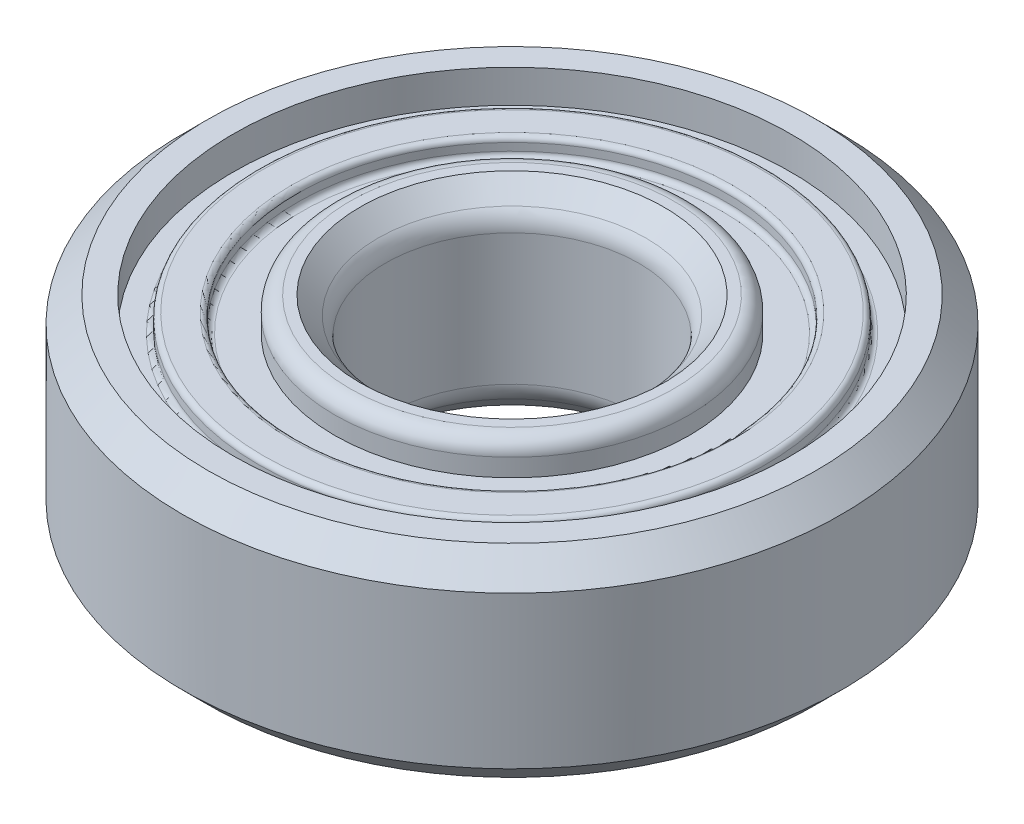
ISO-10303-21;
HEADER;
FILE_DESCRIPTION(('STEP AP214'),'2;1');
FILE_NAME('part.step','',(''),(''),'','','');
FILE_SCHEMA(('AUTOMOTIVE_DESIGN { 1 0 10303 214 1 1 1 1 }'));
ENDSEC;
DATA;
#1=APPLICATION_CONTEXT('core data for automotive mechanical design processes');
#2=APPLICATION_PROTOCOL_DEFINITION('international standard','automotive_design',2000,#1);
#3=PRODUCT_CONTEXT('',#1,'mechanical');
#4=PRODUCT('Part','Part','',(#3));
#5=PRODUCT_RELATED_PRODUCT_CATEGORY('part','',(#4));
#6=PRODUCT_DEFINITION_FORMATION('','',#4);
#7=PRODUCT_DEFINITION_CONTEXT('part definition',#1,'design');
#8=PRODUCT_DEFINITION('design','',#6,#7);
#9=PRODUCT_DEFINITION_SHAPE('','',#8);
#10=(LENGTH_UNIT() NAMED_UNIT(*) SI_UNIT(.MILLI.,.METRE.));
#11=(NAMED_UNIT(*) PLANE_ANGLE_UNIT() SI_UNIT($,.RADIAN.));
#12=(NAMED_UNIT(*) SI_UNIT($,.STERADIAN.) SOLID_ANGLE_UNIT());
#13=UNCERTAINTY_MEASURE_WITH_UNIT(LENGTH_MEASURE(1.E-05),#10,'distance_accuracy_value','');
#14=(GEOMETRIC_REPRESENTATION_CONTEXT(3) GLOBAL_UNCERTAINTY_ASSIGNED_CONTEXT((#13)) GLOBAL_UNIT_ASSIGNED_CONTEXT((#10,
#11,#12)) REPRESENTATION_CONTEXT('',''));
#15=CARTESIAN_POINT('',(0.,0.,0.));
#16=DIRECTION('',(0.,0.,1.));
#17=DIRECTION('',(1.,0.,0.));
#18=AXIS2_PLACEMENT_3D('',#15,#16,#17);
#19=CARTESIAN_POINT('',(0.,4.,0.));
#20=DIRECTION('',(0.,-1.,0.));
#21=DIRECTION('',(0.,0.,-1.));
#22=AXIS2_PLACEMENT_3D('',#19,#20,#21);
#23=CYLINDRICAL_SURFACE('',#22,13.);
#24=CARTESIAN_POINT('',(0.,-2.99999999999998,0.));
#25=DIRECTION('',(0.,-1.,0.));
#26=DIRECTION('',(0.,0.,-1.));
#27=AXIS2_PLACEMENT_3D('',#24,#25,#26);
#28=CIRCLE('',#27,13.);
#29=CARTESIAN_POINT('',(0.,-2.99999999999998,-13.));
#30=VERTEX_POINT('',#29);
#31=EDGE_CURVE('E103',#30,#30,#28,.F.);
#32=ORIENTED_EDGE('',*,*,#31,.T.);
#33=EDGE_LOOP('',(#32));
#34=FACE_BOUND('',#33,.T.);
#35=CARTESIAN_POINT('',(0.,3.,0.));
#36=DIRECTION('',(0.,1.,0.));
#37=DIRECTION('',(0.,0.,1.));
#38=AXIS2_PLACEMENT_3D('',#35,#36,#37);
#39=CIRCLE('',#38,13.);
#40=CARTESIAN_POINT('',(0.,3.,13.));
#41=VERTEX_POINT('',#40);
#42=EDGE_CURVE('E163',#41,#41,#39,.F.);
#43=ORIENTED_EDGE('',*,*,#42,.T.);
#44=EDGE_LOOP('',(#43));
#45=FACE_BOUND('',#44,.T.);
#46=ADVANCED_FACE('F39',(#34,#45),#23,.T.);
#47=CARTESIAN_POINT('',(0.,4.,0.));
#48=DIRECTION('',(0.,1.,0.));
#49=DIRECTION('',(0.,0.,1.));
#50=AXIS2_PLACEMENT_3D('',#47,#48,#49);
#51=PLANE('',#50);
#52=CARTESIAN_POINT('',(0.,4.,0.));
#53=DIRECTION('',(0.,1.,0.));
#54=DIRECTION('',(0.,0.,1.));
#55=AXIS2_PLACEMENT_3D('',#52,#53,#54);
#56=CIRCLE('',#55,12.);
#57=CARTESIAN_POINT('',(0.,4.,12.));
#58=VERTEX_POINT('',#57);
#59=EDGE_CURVE('E167',#58,#58,#56,.T.);
#60=ORIENTED_EDGE('',*,*,#59,.T.);
#61=EDGE_LOOP('',(#60));
#62=FACE_BOUND('',#61,.T.);
#63=CARTESIAN_POINT('',(0.,4.,0.));
#64=DIRECTION('',(0.,1.,0.));
#65=DIRECTION('',(0.,0.,1.));
#66=AXIS2_PLACEMENT_3D('',#63,#64,#65);
#67=CIRCLE('',#66,11.);
#68=CARTESIAN_POINT('',(0.,4.,11.));
#69=VERTEX_POINT('',#68);
#70=EDGE_CURVE('E172',#69,#69,#67,.T.);
#71=ORIENTED_EDGE('',*,*,#70,.F.);
#72=EDGE_LOOP('',(#71));
#73=FACE_BOUND('',#72,.T.);
#74=ADVANCED_FACE('F214',(#62,#73),#51,.T.);
#75=CARTESIAN_POINT('',(0.,2.7,0.));
#76=DIRECTION('',(0.,1.,0.));
#77=DIRECTION('',(0.,0.,1.));
#78=AXIS2_PLACEMENT_3D('',#75,#76,#77);
#79=CYLINDRICAL_SURFACE('',#78,11.);
#80=CARTESIAN_POINT('',(0.,2.7,0.));
#81=DIRECTION('',(0.,1.,0.));
#82=DIRECTION('',(0.,0.,1.));
#83=AXIS2_PLACEMENT_3D('',#80,#81,#82);
#84=CIRCLE('',#83,11.);
#85=CARTESIAN_POINT('',(0.,2.7,11.));
#86=VERTEX_POINT('',#85);
#87=EDGE_CURVE('E171',#86,#86,#84,.T.);
#88=ORIENTED_EDGE('',*,*,#87,.F.);
#89=EDGE_LOOP('',(#88));
#90=FACE_BOUND('',#89,.T.);
#91=ORIENTED_EDGE('',*,*,#70,.T.);
#92=EDGE_LOOP('',(#91));
#93=FACE_BOUND('',#92,.T.);
#94=ADVANCED_FACE('F220',(#90,#93),#79,.F.);
#95=CARTESIAN_POINT('',(0.,2.7,0.));
#96=DIRECTION('',(0.,1.,0.));
#97=DIRECTION('',(0.,0.,1.));
#98=AXIS2_PLACEMENT_3D('',#95,#96,#97);
#99=PLANE('',#98);
#100=CARTESIAN_POINT('',(0.,2.7,0.));
#101=DIRECTION('',(0.,1.,0.));
#102=DIRECTION('',(0.,0.,1.));
#103=AXIS2_PLACEMENT_3D('',#100,#101,#102);
#104=CIRCLE('',#103,10.2);
#105=CARTESIAN_POINT('',(0.,2.7,10.2));
#106=VERTEX_POINT('',#105);
#107=EDGE_CURVE('E131',#106,#106,#104,.F.);
#108=ORIENTED_EDGE('',*,*,#107,.T.);
#109=EDGE_LOOP('',(#108));
#110=FACE_BOUND('',#109,.T.);
#111=ORIENTED_EDGE('',*,*,#87,.T.);
#112=EDGE_LOOP('',(#111));
#113=FACE_BOUND('',#112,.T.);
#114=ADVANCED_FACE('F499',(#110,#113),#99,.T.);
#115=CARTESIAN_POINT('',(0.,3.4,0.));
#116=DIRECTION('',(0.,1.,0.));
#117=DIRECTION('',(0.,0.,1.));
#118=AXIS2_PLACEMENT_3D('',#115,#116,#117);
#119=PLANE('',#118);
#120=CARTESIAN_POINT('',(0.,3.4,0.));
#121=DIRECTION('',(0.,1.,0.));
#122=DIRECTION('',(0.,0.,1.));
#123=AXIS2_PLACEMENT_3D('',#120,#121,#122);
#124=CIRCLE('',#123,9.8);
#125=CARTESIAN_POINT('',(0.,3.4,9.8));
#126=VERTEX_POINT('',#125);
#127=EDGE_CURVE('E123',#126,#126,#124,.T.);
#128=ORIENTED_EDGE('',*,*,#127,.T.);
#129=EDGE_LOOP('',(#128));
#130=FACE_BOUND('',#129,.T.);
#131=CARTESIAN_POINT('',(0.,3.4,0.));
#132=DIRECTION('',(0.,1.,0.));
#133=DIRECTION('',(0.,0.,1.));
#134=AXIS2_PLACEMENT_3D('',#131,#132,#133);
#135=CIRCLE('',#134,8.7);
#136=CARTESIAN_POINT('',(0.,3.4,8.7));
#137=VERTEX_POINT('',#136);
#138=EDGE_CURVE('E127',#137,#137,#135,.F.);
#139=ORIENTED_EDGE('',*,*,#138,.T.);
#140=EDGE_LOOP('',(#139));
#141=FACE_BOUND('',#140,.T.);
#142=ADVANCED_FACE('F512',(#130,#141),#119,.T.);
#143=CARTESIAN_POINT('',(0.,3.4,0.));
#144=DIRECTION('',(0.,-1.,0.));
#145=DIRECTION('',(0.,0.,-1.));
#146=AXIS2_PLACEMENT_3D('',#143,#144,#145);
#147=CYLINDRICAL_SURFACE('',#146,10.);
#148=CARTESIAN_POINT('',(0.,2.9,0.));
#149=DIRECTION('',(0.,1.,0.));
#150=DIRECTION('',(0.,0.,1.));
#151=AXIS2_PLACEMENT_3D('',#148,#149,#150);
#152=CIRCLE('',#151,10.);
#153=CARTESIAN_POINT('',(0.,2.9,10.));
#154=VERTEX_POINT('',#153);
#155=EDGE_CURVE('E135',#154,#154,#152,.T.);
#156=ORIENTED_EDGE('',*,*,#155,.T.);
#157=EDGE_LOOP('',(#156));
#158=FACE_BOUND('',#157,.T.);
#159=CARTESIAN_POINT('',(0.,3.2,0.));
#160=DIRECTION('',(0.,1.,0.));
#161=DIRECTION('',(0.,0.,1.));
#162=AXIS2_PLACEMENT_3D('',#159,#160,#161);
#163=CIRCLE('',#162,10.);
#164=CARTESIAN_POINT('',(0.,3.2,10.));
#165=VERTEX_POINT('',#164);
#166=EDGE_CURVE('E139',#165,#165,#163,.F.);
#167=ORIENTED_EDGE('',*,*,#166,.T.);
#168=EDGE_LOOP('',(#167));
#169=FACE_BOUND('',#168,.T.);
#170=ADVANCED_FACE('F504',(#158,#169),#147,.T.);
#171=CARTESIAN_POINT('',(0.,3.4,0.));
#172=DIRECTION('',(0.,-1.,0.));
#173=DIRECTION('',(0.,0.,-1.));
#174=AXIS2_PLACEMENT_3D('',#171,#172,#173);
#175=CYLINDRICAL_SURFACE('',#174,8.5);
#176=CARTESIAN_POINT('',(0.,3.2,0.));
#177=DIRECTION('',(0.,1.,0.));
#178=DIRECTION('',(0.,0.,1.));
#179=AXIS2_PLACEMENT_3D('',#176,#177,#178);
#180=CIRCLE('',#179,8.5);
#181=CARTESIAN_POINT('',(0.,3.2,8.5));
#182=VERTEX_POINT('',#181);
#183=EDGE_CURVE('E115',#182,#182,#180,.T.);
#184=ORIENTED_EDGE('',*,*,#183,.T.);
#185=EDGE_LOOP('',(#184));
#186=FACE_BOUND('',#185,.T.);
#187=CARTESIAN_POINT('',(0.,2.9,0.));
#188=DIRECTION('',(0.,1.,0.));
#189=DIRECTION('',(0.,0.,1.));
#190=AXIS2_PLACEMENT_3D('',#187,#188,#189);
#191=CIRCLE('',#190,8.5);
#192=CARTESIAN_POINT('',(0.,2.9,8.5));
#193=VERTEX_POINT('',#192);
#194=EDGE_CURVE('E119',#193,#193,#191,.F.);
#195=ORIENTED_EDGE('',*,*,#194,.T.);
#196=EDGE_LOOP('',(#195));
#197=FACE_BOUND('',#196,.T.);
#198=ADVANCED_FACE('F496',(#186,#197),#175,.F.);
#199=CARTESIAN_POINT('',(0.,2.7,0.));
#200=DIRECTION('',(0.,1.,0.));
#201=DIRECTION('',(0.,0.,1.));
#202=AXIS2_PLACEMENT_3D('',#199,#200,#201);
#203=CIRCLE('',#202,8.3);
#204=CARTESIAN_POINT('',(0.,2.7,8.3));
#205=VERTEX_POINT('',#204);
#206=EDGE_CURVE('E111',#205,#205,#203,.T.);
#207=ORIENTED_EDGE('',*,*,#206,.T.);
#208=EDGE_LOOP('',(#207));
#209=FACE_BOUND('',#208,.T.);
#210=CARTESIAN_POINT('',(0.,2.7,0.));
#211=DIRECTION('',(0.,1.,0.));
#212=DIRECTION('',(0.,0.,1.));
#213=AXIS2_PLACEMENT_3D('',#210,#211,#212);
#214=CIRCLE('',#213,7.);
#215=CARTESIAN_POINT('',(0.,2.7,7.));
#216=VERTEX_POINT('',#215);
#217=EDGE_CURVE('E176',#216,#216,#214,.T.);
#218=ORIENTED_EDGE('',*,*,#217,.F.);
#219=EDGE_LOOP('',(#218));
#220=FACE_BOUND('',#219,.T.);
#221=ADVANCED_FACE('F490',(#209,#220),#99,.T.);
#222=CARTESIAN_POINT('',(0.,4.,0.));
#223=DIRECTION('',(0.,1.,0.));
#224=DIRECTION('',(0.,0.,1.));
#225=AXIS2_PLACEMENT_3D('',#222,#223,#224);
#226=PLANE('',#225);
#227=CARTESIAN_POINT('',(0.,4.,0.));
#228=DIRECTION('',(0.,1.,0.));
#229=DIRECTION('',(0.,0.,1.));
#230=AXIS2_PLACEMENT_3D('',#227,#228,#229);
#231=CIRCLE('',#230,6.4);
#232=CARTESIAN_POINT('',(0.,4.,6.4));
#233=VERTEX_POINT('',#232);
#234=EDGE_CURVE('E147',#233,#233,#231,.T.);
#235=ORIENTED_EDGE('',*,*,#234,.T.);
#236=EDGE_LOOP('',(#235));
#237=FACE_BOUND('',#236,.T.);
#238=CARTESIAN_POINT('',(0.,4.,0.));
#239=DIRECTION('',(0.,1.,0.));
#240=DIRECTION('',(0.,0.,1.));
#241=AXIS2_PLACEMENT_3D('',#238,#239,#240);
#242=CIRCLE('',#241,6.00000000000001);
#243=CARTESIAN_POINT('',(0.,4.,6.00000000000001));
#244=VERTEX_POINT('',#243);
#245=EDGE_CURVE('E159',#244,#244,#242,.F.);
#246=ORIENTED_EDGE('',*,*,#245,.T.);
#247=EDGE_LOOP('',(#246));
#248=FACE_BOUND('',#247,.T.);
#249=ADVANCED_FACE('F482',(#237,#248),#226,.T.);
#250=CARTESIAN_POINT('',(0.,4.,0.));
#251=DIRECTION('',(0.,-1.,0.));
#252=DIRECTION('',(0.,0.,-1.));
#253=AXIS2_PLACEMENT_3D('',#250,#251,#252);
#254=CYLINDRICAL_SURFACE('',#253,7.);
#255=CARTESIAN_POINT('',(0.,3.4,0.));
#256=DIRECTION('',(0.,1.,0.));
#257=DIRECTION('',(0.,0.,1.));
#258=AXIS2_PLACEMENT_3D('',#255,#256,#257);
#259=CIRCLE('',#258,7.);
#260=CARTESIAN_POINT('',(0.,3.4,7.));
#261=VERTEX_POINT('',#260);
#262=EDGE_CURVE('E143',#261,#261,#259,.F.);
#263=ORIENTED_EDGE('',*,*,#262,.T.);
#264=EDGE_LOOP('',(#263));
#265=FACE_BOUND('',#264,.T.);
#266=ORIENTED_EDGE('',*,*,#217,.T.);
#267=EDGE_LOOP('',(#266));
#268=FACE_BOUND('',#267,.T.);
#269=ADVANCED_FACE('F378',(#265,#268),#254,.T.);
#270=CARTESIAN_POINT('',(0.,4.,0.));
#271=DIRECTION('',(0.,-1.,0.));
#272=DIRECTION('',(0.,0.,-1.));
#273=AXIS2_PLACEMENT_3D('',#270,#271,#272);
#274=CYLINDRICAL_SURFACE('',#273,5.);
#275=CARTESIAN_POINT('',(0.,-2.58578643762689,0.));
#276=DIRECTION('',(0.,1.,0.));
#277=DIRECTION('',(0.,0.,1.));
#278=AXIS2_PLACEMENT_3D('',#275,#276,#277);
#279=CIRCLE('',#278,5.);
#280=CARTESIAN_POINT('',(0.,-2.58578643762689,5.));
#281=VERTEX_POINT('',#280);
#282=EDGE_CURVE('E91',#281,#281,#279,.F.);
#283=ORIENTED_EDGE('',*,*,#282,.T.);
#284=EDGE_LOOP('',(#283));
#285=FACE_BOUND('',#284,.T.);
#286=CARTESIAN_POINT('',(0.,2.5857864376269,0.));
#287=DIRECTION('',(0.,-1.,0.));
#288=DIRECTION('',(0.,0.,-1.));
#289=AXIS2_PLACEMENT_3D('',#286,#287,#288);
#290=CIRCLE('',#289,5.);
#291=CARTESIAN_POINT('',(0.,2.5857864376269,-5.));
#292=VERTEX_POINT('',#291);
#293=EDGE_CURVE('E155',#292,#292,#290,.F.);
#294=ORIENTED_EDGE('',*,*,#293,.T.);
#295=EDGE_LOOP('',(#294));
#296=FACE_BOUND('',#295,.T.);
#297=ADVANCED_FACE('F230',(#285,#296),#274,.F.);
#298=CARTESIAN_POINT('',(0.,4.,0.));
#299=DIRECTION('',(0.,-1.,0.));
#300=DIRECTION('',(0.,0.,-1.));
#301=AXIS2_PLACEMENT_3D('',#298,#299,#300);
#302=CONICAL_SURFACE('',#301,12.,0.785398163397448);
#303=ORIENTED_EDGE('',*,*,#42,.F.);
#304=EDGE_LOOP('',(#303));
#305=FACE_BOUND('',#304,.T.);
#306=ORIENTED_EDGE('',*,*,#59,.F.);
#307=EDGE_LOOP('',(#306));
#308=FACE_BOUND('',#307,.T.);
#309=ADVANCED_FACE('F226',(#305,#308),#302,.T.);
#310=CARTESIAN_POINT('',(0.,3.,0.));
#311=DIRECTION('',(0.,1.,0.));
#312=DIRECTION('',(0.,0.,1.));
#313=AXIS2_PLACEMENT_3D('',#310,#311,#312);
#314=CONICAL_SURFACE('',#313,5.,0.78539816339745);
#315=CARTESIAN_POINT('',(0.,3.29289321881345,0.));
#316=DIRECTION('',(0.,-1.,0.));
#317=DIRECTION('',(0.,0.,-1.));
#318=AXIS2_PLACEMENT_3D('',#315,#316,#317);
#319=CIRCLE('',#318,5.29289321881345);
#320=CARTESIAN_POINT('',(0.,3.29289321881345,-5.29289321881345));
#321=VERTEX_POINT('',#320);
#322=EDGE_CURVE('E151',#321,#321,#319,.T.);
#323=ORIENTED_EDGE('',*,*,#322,.T.);
#324=EDGE_LOOP('',(#323));
#325=FACE_BOUND('',#324,.T.);
#326=ORIENTED_EDGE('',*,*,#245,.F.);
#327=EDGE_LOOP('',(#326));
#328=FACE_BOUND('',#327,.T.);
#329=ADVANCED_FACE('F229',(#325,#328),#314,.F.);
#330=CARTESIAN_POINT('',(0.,2.5857864376269,0.));
#331=DIRECTION('',(0.,-1.,0.));
#332=DIRECTION('',(0.,0.,-1.));
#333=AXIS2_PLACEMENT_3D('',#330,#331,#332);
#334=TOROIDAL_SURFACE('',#333,6.,1.);
#335=ORIENTED_EDGE('',*,*,#322,.F.);
#336=EDGE_LOOP('',(#335));
#337=FACE_BOUND('',#336,.T.);
#338=ORIENTED_EDGE('',*,*,#293,.F.);
#339=EDGE_LOOP('',(#338));
#340=FACE_BOUND('',#339,.T.);
#341=ADVANCED_FACE('F234',(#337,#340),#334,.T.);
#342=CARTESIAN_POINT('',(0.,3.4,0.));
#343=DIRECTION('',(0.,1.,0.));
#344=DIRECTION('',(0.,0.,1.));
#345=AXIS2_PLACEMENT_3D('',#342,#343,#344);
#346=TOROIDAL_SURFACE('',#345,6.4,0.6);
#347=ORIENTED_EDGE('',*,*,#262,.F.);
#348=EDGE_LOOP('',(#347));
#349=FACE_BOUND('',#348,.T.);
#350=ORIENTED_EDGE('',*,*,#234,.F.);
#351=EDGE_LOOP('',(#350));
#352=FACE_BOUND('',#351,.T.);
#353=ADVANCED_FACE('F238',(#349,#352),#346,.T.);
#354=CARTESIAN_POINT('',(0.,2.9,0.));
#355=DIRECTION('',(0.,1.,0.));
#356=DIRECTION('',(0.,0.,1.));
#357=AXIS2_PLACEMENT_3D('',#354,#355,#356);
#358=TOROIDAL_SURFACE('',#357,10.2,0.2);
#359=ORIENTED_EDGE('',*,*,#107,.F.);
#360=EDGE_LOOP('',(#359));
#361=FACE_BOUND('',#360,.T.);
#362=ORIENTED_EDGE('',*,*,#155,.F.);
#363=EDGE_LOOP('',(#362));
#364=FACE_BOUND('',#363,.T.);
#365=ADVANCED_FACE('F242',(#361,#364),#358,.F.);
#366=CARTESIAN_POINT('',(0.,3.2,0.));
#367=DIRECTION('',(0.,1.,0.));
#368=DIRECTION('',(0.,0.,1.));
#369=AXIS2_PLACEMENT_3D('',#366,#367,#368);
#370=TOROIDAL_SURFACE('',#369,9.8,0.2);
#371=ORIENTED_EDGE('',*,*,#166,.F.);
#372=EDGE_LOOP('',(#371));
#373=FACE_BOUND('',#372,.T.);
#374=ORIENTED_EDGE('',*,*,#127,.F.);
#375=EDGE_LOOP('',(#374));
#376=FACE_BOUND('',#375,.T.);
#377=ADVANCED_FACE('F246',(#373,#376),#370,.T.);
#378=CARTESIAN_POINT('',(0.,3.2,0.));
#379=DIRECTION('',(0.,1.,0.));
#380=DIRECTION('',(0.,0.,1.));
#381=AXIS2_PLACEMENT_3D('',#378,#379,#380);
#382=TOROIDAL_SURFACE('',#381,8.7,0.2);
#383=ORIENTED_EDGE('',*,*,#138,.F.);
#384=EDGE_LOOP('',(#383));
#385=FACE_BOUND('',#384,.T.);
#386=ORIENTED_EDGE('',*,*,#183,.F.);
#387=EDGE_LOOP('',(#386));
#388=FACE_BOUND('',#387,.T.);
#389=ADVANCED_FACE('F250',(#385,#388),#382,.T.);
#390=CARTESIAN_POINT('',(0.,2.9,0.));
#391=DIRECTION('',(0.,1.,0.));
#392=DIRECTION('',(0.,0.,1.));
#393=AXIS2_PLACEMENT_3D('',#390,#391,#392);
#394=TOROIDAL_SURFACE('',#393,8.3,0.2);
#395=ORIENTED_EDGE('',*,*,#206,.F.);
#396=EDGE_LOOP('',(#395));
#397=FACE_BOUND('',#396,.T.);
#398=ORIENTED_EDGE('',*,*,#194,.F.);
#399=EDGE_LOOP('',(#398));
#400=FACE_BOUND('',#399,.T.);
#401=ADVANCED_FACE('F254',(#397,#400),#394,.F.);
#402=CARTESIAN_POINT('',(0.,-4.,0.));
#403=DIRECTION('',(0.,-1.,0.));
#404=DIRECTION('',(0.,0.,1.));
#405=AXIS2_PLACEMENT_3D('',#402,#403,#404);
#406=PLANE('',#405);
#407=CARTESIAN_POINT('',(0.,-4.,0.));
#408=DIRECTION('',(0.,-1.,0.));
#409=DIRECTION('',(0.,0.,-1.));
#410=AXIS2_PLACEMENT_3D('',#407,#408,#409);
#411=CIRCLE('',#410,12.);
#412=CARTESIAN_POINT('',(0.,-4.,-12.));
#413=VERTEX_POINT('',#412);
#414=EDGE_CURVE('E99',#413,#413,#411,.T.);
#415=ORIENTED_EDGE('',*,*,#414,.T.);
#416=EDGE_LOOP('',(#415));
#417=FACE_BOUND('',#416,.T.);
#418=CARTESIAN_POINT('',(0.,-4.,0.));
#419=DIRECTION('',(0.,1.,0.));
#420=DIRECTION('',(0.,0.,1.));
#421=AXIS2_PLACEMENT_3D('',#418,#419,#420);
#422=CIRCLE('',#421,11.);
#423=CARTESIAN_POINT('',(0.,-4.,11.));
#424=VERTEX_POINT('',#423);
#425=EDGE_CURVE('E184',#424,#424,#422,.T.);
#426=ORIENTED_EDGE('',*,*,#425,.T.);
#427=EDGE_LOOP('',(#426));
#428=FACE_BOUND('',#427,.T.);
#429=ADVANCED_FACE('F208',(#417,#428),#406,.T.);
#430=CARTESIAN_POINT('',(0.,-2.7,0.));
#431=DIRECTION('',(0.,-1.,0.));
#432=DIRECTION('',(0.,0.,-1.));
#433=AXIS2_PLACEMENT_3D('',#430,#431,#432);
#434=CYLINDRICAL_SURFACE('',#433,11.);
#435=CARTESIAN_POINT('',(0.,-2.7,0.));
#436=DIRECTION('',(0.,1.,0.));
#437=DIRECTION('',(0.,0.,1.));
#438=AXIS2_PLACEMENT_3D('',#435,#436,#437);
#439=CIRCLE('',#438,11.);
#440=CARTESIAN_POINT('',(0.,-2.7,11.));
#441=VERTEX_POINT('',#440);
#442=EDGE_CURVE('E183',#441,#441,#439,.T.);
#443=ORIENTED_EDGE('',*,*,#442,.T.);
#444=EDGE_LOOP('',(#443));
#445=FACE_BOUND('',#444,.T.);
#446=ORIENTED_EDGE('',*,*,#425,.F.);
#447=EDGE_LOOP('',(#446));
#448=FACE_BOUND('',#447,.T.);
#449=ADVANCED_FACE('F192',(#445,#448),#434,.F.);
#450=CARTESIAN_POINT('',(0.,-2.7,0.));
#451=DIRECTION('',(0.,-1.,0.));
#452=DIRECTION('',(0.,0.,1.));
#453=AXIS2_PLACEMENT_3D('',#450,#451,#452);
#454=PLANE('',#453);
#455=CARTESIAN_POINT('',(0.,-2.7,0.));
#456=DIRECTION('',(0.,-1.,0.));
#457=DIRECTION('',(0.,0.,-1.));
#458=AXIS2_PLACEMENT_3D('',#455,#456,#457);
#459=CIRCLE('',#458,10.2);
#460=CARTESIAN_POINT('',(0.,-2.7,-10.2));
#461=VERTEX_POINT('',#460);
#462=EDGE_CURVE('E67',#461,#461,#459,.F.);
#463=ORIENTED_EDGE('',*,*,#462,.T.);
#464=EDGE_LOOP('',(#463));
#465=FACE_BOUND('',#464,.T.);
#466=ORIENTED_EDGE('',*,*,#442,.F.);
#467=EDGE_LOOP('',(#466));
#468=FACE_BOUND('',#467,.T.);
#469=ADVANCED_FACE('F195',(#465,#468),#454,.T.);
#470=CARTESIAN_POINT('',(0.,-3.4,0.));
#471=DIRECTION('',(0.,1.,0.));
#472=DIRECTION('',(0.,0.,1.));
#473=AXIS2_PLACEMENT_3D('',#470,#471,#472);
#474=CYLINDRICAL_SURFACE('',#473,10.);
#475=CARTESIAN_POINT('',(0.,-2.9,0.));
#476=DIRECTION('',(0.,-1.,0.));
#477=DIRECTION('',(0.,0.,-1.));
#478=AXIS2_PLACEMENT_3D('',#475,#476,#477);
#479=CIRCLE('',#478,10.);
#480=CARTESIAN_POINT('',(0.,-2.9,-10.));
#481=VERTEX_POINT('',#480);
#482=EDGE_CURVE('E71',#481,#481,#479,.T.);
#483=ORIENTED_EDGE('',*,*,#482,.T.);
#484=EDGE_LOOP('',(#483));
#485=FACE_BOUND('',#484,.T.);
#486=CARTESIAN_POINT('',(0.,-3.2,0.));
#487=DIRECTION('',(0.,-1.,0.));
#488=DIRECTION('',(0.,0.,-1.));
#489=AXIS2_PLACEMENT_3D('',#486,#487,#488);
#490=CIRCLE('',#489,10.);
#491=CARTESIAN_POINT('',(0.,-3.2,-10.));
#492=VERTEX_POINT('',#491);
#493=EDGE_CURVE('E75',#492,#492,#490,.F.);
#494=ORIENTED_EDGE('',*,*,#493,.T.);
#495=EDGE_LOOP('',(#494));
#496=FACE_BOUND('',#495,.T.);
#497=ADVANCED_FACE('F197',(#485,#496),#474,.T.);
#498=CARTESIAN_POINT('',(0.,-3.4,0.));
#499=DIRECTION('',(0.,-1.,0.));
#500=DIRECTION('',(0.,0.,1.));
#501=AXIS2_PLACEMENT_3D('',#498,#499,#500);
#502=PLANE('',#501);
#503=CARTESIAN_POINT('',(0.,-3.4,0.));
#504=DIRECTION('',(0.,-1.,0.));
#505=DIRECTION('',(0.,0.,-1.));
#506=AXIS2_PLACEMENT_3D('',#503,#504,#505);
#507=CIRCLE('',#506,9.8);
#508=CARTESIAN_POINT('',(0.,-3.4,-9.8));
#509=VERTEX_POINT('',#508);
#510=EDGE_CURVE('E57',#509,#509,#507,.T.);
#511=ORIENTED_EDGE('',*,*,#510,.T.);
#512=EDGE_LOOP('',(#511));
#513=FACE_BOUND('',#512,.T.);
#514=CARTESIAN_POINT('',(0.,-3.4,0.));
#515=DIRECTION('',(0.,-1.,0.));
#516=DIRECTION('',(0.,0.,-1.));
#517=AXIS2_PLACEMENT_3D('',#514,#515,#516);
#518=CIRCLE('',#517,8.7);
#519=CARTESIAN_POINT('',(0.,-3.4,-8.7));
#520=VERTEX_POINT('',#519);
#521=EDGE_CURVE('E63',#520,#520,#518,.F.);
#522=ORIENTED_EDGE('',*,*,#521,.T.);
#523=EDGE_LOOP('',(#522));
#524=FACE_BOUND('',#523,.T.);
#525=ADVANCED_FACE('F205',(#513,#524),#502,.T.);
#526=CARTESIAN_POINT('',(0.,-3.4,0.));
#527=DIRECTION('',(0.,1.,0.));
#528=DIRECTION('',(0.,0.,1.));
#529=AXIS2_PLACEMENT_3D('',#526,#527,#528);
#530=CYLINDRICAL_SURFACE('',#529,8.5);
#531=CARTESIAN_POINT('',(0.,-3.2,0.));
#532=DIRECTION('',(0.,-1.,0.));
#533=DIRECTION('',(0.,0.,-1.));
#534=AXIS2_PLACEMENT_3D('',#531,#532,#533);
#535=CIRCLE('',#534,8.5);
#536=CARTESIAN_POINT('',(0.,-3.2,-8.5));
#537=VERTEX_POINT('',#536);
#538=EDGE_CURVE('E47',#537,#537,#535,.T.);
#539=ORIENTED_EDGE('',*,*,#538,.T.);
#540=EDGE_LOOP('',(#539));
#541=FACE_BOUND('',#540,.T.);
#542=CARTESIAN_POINT('',(0.,-2.9,0.));
#543=DIRECTION('',(0.,-1.,0.));
#544=DIRECTION('',(0.,0.,-1.));
#545=AXIS2_PLACEMENT_3D('',#542,#543,#544);
#546=CIRCLE('',#545,8.5);
#547=CARTESIAN_POINT('',(0.,-2.9,-8.5));
#548=VERTEX_POINT('',#547);
#549=EDGE_CURVE('E52',#548,#548,#546,.F.);
#550=ORIENTED_EDGE('',*,*,#549,.T.);
#551=EDGE_LOOP('',(#550));
#552=FACE_BOUND('',#551,.T.);
#553=ADVANCED_FACE('F212',(#541,#552),#530,.F.);
#554=CARTESIAN_POINT('',(0.,-2.7,0.));
#555=DIRECTION('',(0.,-1.,0.));
#556=DIRECTION('',(0.,0.,-1.));
#557=AXIS2_PLACEMENT_3D('',#554,#555,#556);
#558=CIRCLE('',#557,8.3);
#559=CARTESIAN_POINT('',(0.,-2.7,-8.3));
#560=VERTEX_POINT('',#559);
#561=EDGE_CURVE('E10',#560,#560,#558,.T.);
#562=ORIENTED_EDGE('',*,*,#561,.T.);
#563=EDGE_LOOP('',(#562));
#564=FACE_BOUND('',#563,.T.);
#565=CARTESIAN_POINT('',(0.,-2.7,0.));
#566=DIRECTION('',(0.,-1.,0.));
#567=DIRECTION('',(0.,0.,-1.));
#568=AXIS2_PLACEMENT_3D('',#565,#566,#567);
#569=CIRCLE('',#568,7.);
#570=CARTESIAN_POINT('',(0.,-2.7,-7.));
#571=VERTEX_POINT('',#570);
#572=EDGE_CURVE('E107',#571,#571,#569,.T.);
#573=ORIENTED_EDGE('',*,*,#572,.F.);
#574=EDGE_LOOP('',(#573));
#575=FACE_BOUND('',#574,.T.);
#576=ADVANCED_FACE('F200',(#564,#575),#454,.T.);
#577=CARTESIAN_POINT('',(0.,-4.,0.));
#578=DIRECTION('',(0.,1.,0.));
#579=DIRECTION('',(0.,0.,1.));
#580=AXIS2_PLACEMENT_3D('',#577,#578,#579);
#581=CYLINDRICAL_SURFACE('',#580,7.);
#582=CARTESIAN_POINT('',(0.,-3.4,0.));
#583=DIRECTION('',(0.,-1.,0.));
#584=DIRECTION('',(0.,0.,-1.));
#585=AXIS2_PLACEMENT_3D('',#582,#583,#584);
#586=CIRCLE('',#585,7.);
#587=CARTESIAN_POINT('',(0.,-3.4,-7.));
#588=VERTEX_POINT('',#587);
#589=EDGE_CURVE('E83',#588,#588,#586,.F.);
#590=ORIENTED_EDGE('',*,*,#589,.T.);
#591=EDGE_LOOP('',(#590));
#592=FACE_BOUND('',#591,.T.);
#593=ORIENTED_EDGE('',*,*,#572,.T.);
#594=EDGE_LOOP('',(#593));
#595=FACE_BOUND('',#594,.T.);
#596=ADVANCED_FACE('F211',(#592,#595),#581,.T.);
#597=CARTESIAN_POINT('',(0.,-4.,0.));
#598=DIRECTION('',(0.,-1.,0.));
#599=DIRECTION('',(0.,0.,1.));
#600=AXIS2_PLACEMENT_3D('',#597,#598,#599);
#601=PLANE('',#600);
#602=CARTESIAN_POINT('',(0.,-4.,0.));
#603=DIRECTION('',(0.,-1.,0.));
#604=DIRECTION('',(0.,0.,-1.));
#605=AXIS2_PLACEMENT_3D('',#602,#603,#604);
#606=CIRCLE('',#605,6.4);
#607=CARTESIAN_POINT('',(0.,-4.,-6.4));
#608=VERTEX_POINT('',#607);
#609=EDGE_CURVE('E79',#608,#608,#606,.T.);
#610=ORIENTED_EDGE('',*,*,#609,.T.);
#611=EDGE_LOOP('',(#610));
#612=FACE_BOUND('',#611,.T.);
#613=CARTESIAN_POINT('',(0.,-4.,0.));
#614=DIRECTION('',(0.,-1.,0.));
#615=DIRECTION('',(0.,0.,-1.));
#616=AXIS2_PLACEMENT_3D('',#613,#614,#615);
#617=CIRCLE('',#616,6.00000000000002);
#618=CARTESIAN_POINT('',(0.,-4.,-6.00000000000002));
#619=VERTEX_POINT('',#618);
#620=EDGE_CURVE('E95',#619,#619,#617,.F.);
#621=ORIENTED_EDGE('',*,*,#620,.T.);
#622=EDGE_LOOP('',(#621));
#623=FACE_BOUND('',#622,.T.);
#624=ADVANCED_FACE('F263',(#612,#623),#601,.T.);
#625=CARTESIAN_POINT('',(0.,-2.99999999999998,0.));
#626=DIRECTION('',(0.,1.,0.));
#627=DIRECTION('',(0.,0.,1.));
#628=AXIS2_PLACEMENT_3D('',#625,#626,#627);
#629=CONICAL_SURFACE('',#628,13.,0.785398163397444);
#630=ORIENTED_EDGE('',*,*,#414,.F.);
#631=EDGE_LOOP('',(#630));
#632=FACE_BOUND('',#631,.T.);
#633=ORIENTED_EDGE('',*,*,#31,.F.);
#634=EDGE_LOOP('',(#633));
#635=FACE_BOUND('',#634,.T.);
#636=ADVANCED_FACE('F259',(#632,#635),#629,.T.);
#637=CARTESIAN_POINT('',(0.,-4.,0.));
#638=DIRECTION('',(0.,-1.,0.));
#639=DIRECTION('',(0.,0.,-1.));
#640=AXIS2_PLACEMENT_3D('',#637,#638,#639);
#641=CONICAL_SURFACE('',#640,6.00000000000002,0.785398163397453);
#642=CARTESIAN_POINT('',(0.,-3.29289321881345,0.));
#643=DIRECTION('',(0.,1.,0.));
#644=DIRECTION('',(0.,0.,1.));
#645=AXIS2_PLACEMENT_3D('',#642,#643,#644);
#646=CIRCLE('',#645,5.29289321881346);
#647=CARTESIAN_POINT('',(0.,-3.29289321881345,5.29289321881346));
#648=VERTEX_POINT('',#647);
#649=EDGE_CURVE('E87',#648,#648,#646,.T.);
#650=ORIENTED_EDGE('',*,*,#649,.T.);
#651=EDGE_LOOP('',(#650));
#652=FACE_BOUND('',#651,.T.);
#653=ORIENTED_EDGE('',*,*,#620,.F.);
#654=EDGE_LOOP('',(#653));
#655=FACE_BOUND('',#654,.T.);
#656=ADVANCED_FACE('F262',(#652,#655),#641,.F.);
#657=CARTESIAN_POINT('',(0.,-2.58578643762689,0.));
#658=DIRECTION('',(0.,1.,0.));
#659=DIRECTION('',(0.,0.,1.));
#660=AXIS2_PLACEMENT_3D('',#657,#658,#659);
#661=TOROIDAL_SURFACE('',#660,6.,1.);
#662=ORIENTED_EDGE('',*,*,#649,.F.);
#663=EDGE_LOOP('',(#662));
#664=FACE_BOUND('',#663,.T.);
#665=ORIENTED_EDGE('',*,*,#282,.F.);
#666=EDGE_LOOP('',(#665));
#667=FACE_BOUND('',#666,.T.);
#668=ADVANCED_FACE('F267',(#664,#667),#661,.T.);
#669=CARTESIAN_POINT('',(0.,-3.4,0.));
#670=DIRECTION('',(0.,-1.,0.));
#671=DIRECTION('',(0.,0.,-1.));
#672=AXIS2_PLACEMENT_3D('',#669,#670,#671);
#673=TOROIDAL_SURFACE('',#672,6.4,0.6);
#674=ORIENTED_EDGE('',*,*,#609,.F.);
#675=EDGE_LOOP('',(#674));
#676=FACE_BOUND('',#675,.T.);
#677=ORIENTED_EDGE('',*,*,#589,.F.);
#678=EDGE_LOOP('',(#677));
#679=FACE_BOUND('',#678,.T.);
#680=ADVANCED_FACE('F271',(#676,#679),#673,.T.);
#681=CARTESIAN_POINT('',(0.,-2.9,0.));
#682=DIRECTION('',(0.,-1.,0.));
#683=DIRECTION('',(0.,0.,-1.));
#684=AXIS2_PLACEMENT_3D('',#681,#682,#683);
#685=TOROIDAL_SURFACE('',#684,10.2,0.2);
#686=ORIENTED_EDGE('',*,*,#462,.F.);
#687=EDGE_LOOP('',(#686));
#688=FACE_BOUND('',#687,.T.);
#689=ORIENTED_EDGE('',*,*,#482,.F.);
#690=EDGE_LOOP('',(#689));
#691=FACE_BOUND('',#690,.T.);
#692=ADVANCED_FACE('F275',(#688,#691),#685,.F.);
#693=CARTESIAN_POINT('',(0.,-3.2,0.));
#694=DIRECTION('',(0.,-1.,0.));
#695=DIRECTION('',(0.,0.,-1.));
#696=AXIS2_PLACEMENT_3D('',#693,#694,#695);
#697=TOROIDAL_SURFACE('',#696,9.8,0.2);
#698=ORIENTED_EDGE('',*,*,#510,.F.);
#699=EDGE_LOOP('',(#698));
#700=FACE_BOUND('',#699,.T.);
#701=ORIENTED_EDGE('',*,*,#493,.F.);
#702=EDGE_LOOP('',(#701));
#703=FACE_BOUND('',#702,.T.);
#704=ADVANCED_FACE('F279',(#700,#703),#697,.T.);
#705=CARTESIAN_POINT('',(0.,-3.2,0.));
#706=DIRECTION('',(0.,-1.,0.));
#707=DIRECTION('',(0.,0.,-1.));
#708=AXIS2_PLACEMENT_3D('',#705,#706,#707);
#709=TOROIDAL_SURFACE('',#708,8.7,0.2);
#710=ORIENTED_EDGE('',*,*,#538,.F.);
#711=EDGE_LOOP('',(#710));
#712=FACE_BOUND('',#711,.T.);
#713=ORIENTED_EDGE('',*,*,#521,.F.);
#714=EDGE_LOOP('',(#713));
#715=FACE_BOUND('',#714,.T.);
#716=ADVANCED_FACE('F282',(#712,#715),#709,.T.);
#717=CARTESIAN_POINT('',(0.,-2.9,0.));
#718=DIRECTION('',(0.,-1.,0.));
#719=DIRECTION('',(0.,0.,-1.));
#720=AXIS2_PLACEMENT_3D('',#717,#718,#719);
#721=TOROIDAL_SURFACE('',#720,8.3,0.2);
#722=ORIENTED_EDGE('',*,*,#561,.F.);
#723=EDGE_LOOP('',(#722));
#724=FACE_BOUND('',#723,.T.);
#725=ORIENTED_EDGE('',*,*,#549,.F.);
#726=EDGE_LOOP('',(#725));
#727=FACE_BOUND('',#726,.T.);
#728=ADVANCED_FACE('F41',(#724,#727),#721,.F.);
#729=CLOSED_SHELL('',(#46,#74,#94,#114,#142,#170,#198,#221,#249,#269,#297,#309,#329,#341,#353,
#365,#377,#389,#401,#429,#449,#469,#497,#525,#553,#576,#596,#624,#636,#656,#668,#680,#692,#704,
#716,#728));
#730=MANIFOLD_SOLID_BREP('B2',#729);
#731=ADVANCED_BREP_SHAPE_REPRESENTATION('',(#18,#730),#14);
#732=SHAPE_DEFINITION_REPRESENTATION(#9,#731);
ENDSEC;
END-ISO-10303-21;
